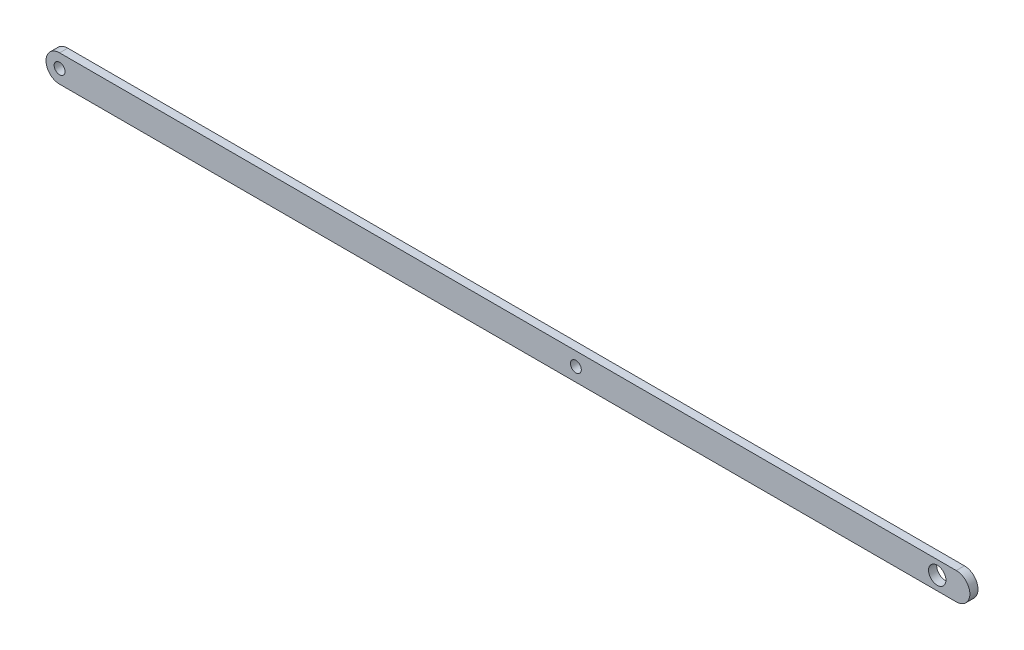
ISO-10303-21;
HEADER;
FILE_DESCRIPTION(('STEP AP214'),'2;1');
FILE_NAME('part.step','',(''),(''),'','','');
FILE_SCHEMA(('AUTOMOTIVE_DESIGN { 1 0 10303 214 1 1 1 1 }'));
ENDSEC;
DATA;
#1=APPLICATION_CONTEXT('core data for automotive mechanical design processes');
#2=APPLICATION_PROTOCOL_DEFINITION('international standard','automotive_design',2000,#1);
#3=PRODUCT_CONTEXT('',#1,'mechanical');
#4=PRODUCT('Part','Part','',(#3));
#5=PRODUCT_RELATED_PRODUCT_CATEGORY('part','',(#4));
#6=PRODUCT_DEFINITION_FORMATION('','',#4);
#7=PRODUCT_DEFINITION_CONTEXT('part definition',#1,'design');
#8=PRODUCT_DEFINITION('design','',#6,#7);
#9=PRODUCT_DEFINITION_SHAPE('','',#8);
#10=(LENGTH_UNIT() NAMED_UNIT(*) SI_UNIT(.MILLI.,.METRE.));
#11=(NAMED_UNIT(*) PLANE_ANGLE_UNIT() SI_UNIT($,.RADIAN.));
#12=(NAMED_UNIT(*) SI_UNIT($,.STERADIAN.) SOLID_ANGLE_UNIT());
#13=UNCERTAINTY_MEASURE_WITH_UNIT(LENGTH_MEASURE(1.E-05),#10,'distance_accuracy_value','');
#14=(GEOMETRIC_REPRESENTATION_CONTEXT(3) GLOBAL_UNCERTAINTY_ASSIGNED_CONTEXT((#13)) GLOBAL_UNIT_ASSIGNED_CONTEXT((#10,
#11,#12)) REPRESENTATION_CONTEXT('',''));
#15=CARTESIAN_POINT('',(0.,0.,0.));
#16=DIRECTION('',(0.,0.,1.));
#17=DIRECTION('',(1.,0.,0.));
#18=AXIS2_PLACEMENT_3D('',#15,#16,#17);
#19=CARTESIAN_POINT('',(0.,0.,3.));
#20=DIRECTION('',(0.,0.,-1.));
#21=DIRECTION('',(-1.,0.,0.));
#22=AXIS2_PLACEMENT_3D('',#19,#20,#21);
#23=CYLINDRICAL_SURFACE('',#22,5.);
#24=CARTESIAN_POINT('',(0.,0.,0.));
#25=DIRECTION('',(0.,0.,1.));
#26=DIRECTION('',(1.,0.,0.));
#27=AXIS2_PLACEMENT_3D('',#24,#25,#26);
#28=CIRCLE('',#27,5.);
#29=CARTESIAN_POINT('',(0.,5.,0.));
#30=VERTEX_POINT('',#29);
#31=CARTESIAN_POINT('',(0.,-5.,0.));
#32=VERTEX_POINT('',#31);
#33=EDGE_CURVE('E110',#30,#32,#28,.T.);
#34=ORIENTED_EDGE('',*,*,#33,.T.);
#35=DIRECTION('',(0.,0.,-1.));
#36=VECTOR('',#35,1.);
#37=CARTESIAN_POINT('',(0.,-5.,3.));
#38=LINE('',#37,#36);
#39=CARTESIAN_POINT('',(0.,-5.,3.));
#40=VERTEX_POINT('',#39);
#41=EDGE_CURVE('E13',#40,#32,#38,.T.);
#42=ORIENTED_EDGE('',*,*,#41,.F.);
#43=CARTESIAN_POINT('',(0.,0.,3.));
#44=DIRECTION('',(0.,0.,1.));
#45=DIRECTION('',(1.,0.,0.));
#46=AXIS2_PLACEMENT_3D('',#43,#44,#45);
#47=CIRCLE('',#46,5.);
#48=CARTESIAN_POINT('',(0.,5.,3.));
#49=VERTEX_POINT('',#48);
#50=EDGE_CURVE('E98',#49,#40,#47,.T.);
#51=ORIENTED_EDGE('',*,*,#50,.F.);
#52=DIRECTION('',(0.,0.,-1.));
#53=VECTOR('',#52,1.);
#54=CARTESIAN_POINT('',(0.,5.,3.));
#55=LINE('',#54,#53);
#56=EDGE_CURVE('E106',#49,#30,#55,.T.);
#57=ORIENTED_EDGE('',*,*,#56,.T.);
#58=EDGE_LOOP('',(#34,#42,#51,#57));
#59=FACE_BOUND('',#58,.T.);
#60=ADVANCED_FACE('F47',(#59),#23,.T.);
#61=CARTESIAN_POINT('',(0.,-5.,3.));
#62=DIRECTION('',(0.,1.,0.));
#63=DIRECTION('',(0.,0.,1.));
#64=AXIS2_PLACEMENT_3D('',#61,#62,#63);
#65=PLANE('',#64);
#66=DIRECTION('',(1.,0.,0.));
#67=VECTOR('',#66,1.);
#68=CARTESIAN_POINT('',(0.,-5.,0.));
#69=LINE('',#68,#67);
#70=CARTESIAN_POINT('',(330.,-5.,0.));
#71=VERTEX_POINT('',#70);
#72=EDGE_CURVE('E102',#32,#71,#69,.T.);
#73=ORIENTED_EDGE('',*,*,#72,.T.);
#74=DIRECTION('',(0.,0.,-1.));
#75=VECTOR('',#74,1.);
#76=CARTESIAN_POINT('',(330.,-5.,3.));
#77=LINE('',#76,#75);
#78=CARTESIAN_POINT('',(330.,-5.,3.));
#79=VERTEX_POINT('',#78);
#80=EDGE_CURVE('E55',#79,#71,#77,.T.);
#81=ORIENTED_EDGE('',*,*,#80,.F.);
#82=DIRECTION('',(1.,0.,0.));
#83=VECTOR('',#82,1.);
#84=CARTESIAN_POINT('',(0.,-5.,3.));
#85=LINE('',#84,#83);
#86=EDGE_CURVE('E93',#40,#79,#85,.T.);
#87=ORIENTED_EDGE('',*,*,#86,.F.);
#88=ORIENTED_EDGE('',*,*,#41,.T.);
#89=EDGE_LOOP('',(#73,#81,#87,#88));
#90=FACE_BOUND('',#89,.T.);
#91=ADVANCED_FACE('F101',(#90),#65,.F.);
#92=CARTESIAN_POINT('',(330.,0.,3.));
#93=DIRECTION('',(0.,0.,-1.));
#94=DIRECTION('',(-1.,0.,0.));
#95=AXIS2_PLACEMENT_3D('',#92,#93,#94);
#96=CYLINDRICAL_SURFACE('',#95,5.);
#97=CARTESIAN_POINT('',(330.,0.,0.));
#98=DIRECTION('',(0.,0.,1.));
#99=DIRECTION('',(1.,0.,0.));
#100=AXIS2_PLACEMENT_3D('',#97,#98,#99);
#101=CIRCLE('',#100,5.);
#102=CARTESIAN_POINT('',(330.,5.,0.));
#103=VERTEX_POINT('',#102);
#104=EDGE_CURVE('E80',#71,#103,#101,.T.);
#105=ORIENTED_EDGE('',*,*,#104,.T.);
#106=DIRECTION('',(0.,0.,-1.));
#107=VECTOR('',#106,1.);
#108=CARTESIAN_POINT('',(330.,5.,3.));
#109=LINE('',#108,#107);
#110=CARTESIAN_POINT('',(330.,5.,3.));
#111=VERTEX_POINT('',#110);
#112=EDGE_CURVE('E103',#111,#103,#109,.T.);
#113=ORIENTED_EDGE('',*,*,#112,.F.);
#114=CARTESIAN_POINT('',(330.,0.,3.));
#115=DIRECTION('',(0.,0.,1.));
#116=DIRECTION('',(1.,0.,0.));
#117=AXIS2_PLACEMENT_3D('',#114,#115,#116);
#118=CIRCLE('',#117,5.);
#119=EDGE_CURVE('E96',#79,#111,#118,.T.);
#120=ORIENTED_EDGE('',*,*,#119,.F.);
#121=ORIENTED_EDGE('',*,*,#80,.T.);
#122=EDGE_LOOP('',(#105,#113,#120,#121));
#123=FACE_BOUND('',#122,.T.);
#124=ADVANCED_FACE('F104',(#123),#96,.T.);
#125=CARTESIAN_POINT('',(0.,5.,3.));
#126=DIRECTION('',(0.,-1.,0.));
#127=DIRECTION('',(0.,0.,-1.));
#128=AXIS2_PLACEMENT_3D('',#125,#126,#127);
#129=PLANE('',#128);
#130=DIRECTION('',(-1.,0.,0.));
#131=VECTOR('',#130,1.);
#132=CARTESIAN_POINT('',(0.,5.,0.));
#133=LINE('',#132,#131);
#134=EDGE_CURVE('E86',#103,#30,#133,.T.);
#135=ORIENTED_EDGE('',*,*,#134,.T.);
#136=ORIENTED_EDGE('',*,*,#56,.F.);
#137=DIRECTION('',(-1.,0.,0.));
#138=VECTOR('',#137,1.);
#139=CARTESIAN_POINT('',(0.,5.,3.));
#140=LINE('',#139,#138);
#141=EDGE_CURVE('E63',#111,#49,#140,.T.);
#142=ORIENTED_EDGE('',*,*,#141,.F.);
#143=ORIENTED_EDGE('',*,*,#112,.T.);
#144=EDGE_LOOP('',(#135,#136,#142,#143));
#145=FACE_BOUND('',#144,.T.);
#146=ADVANCED_FACE('F118',(#145),#129,.F.);
#147=CARTESIAN_POINT('',(0.,0.,3.));
#148=DIRECTION('',(0.,0.,1.));
#149=DIRECTION('',(1.,0.,0.));
#150=AXIS2_PLACEMENT_3D('',#147,#148,#149);
#151=PLANE('',#150);
#152=CARTESIAN_POINT('',(0.,0.,3.));
#153=DIRECTION('',(0.,0.,1.));
#154=DIRECTION('',(1.,0.,0.));
#155=AXIS2_PLACEMENT_3D('',#152,#153,#154);
#156=CIRCLE('',#155,2.);
#157=CARTESIAN_POINT('',(2.,0.,3.));
#158=VERTEX_POINT('',#157);
#159=EDGE_CURVE('E138',#158,#158,#156,.T.);
#160=ORIENTED_EDGE('',*,*,#159,.F.);
#161=EDGE_LOOP('',(#160));
#162=FACE_BOUND('',#161,.T.);
#163=CARTESIAN_POINT('',(190.,0.,3.));
#164=DIRECTION('',(0.,0.,1.));
#165=DIRECTION('',(1.,0.,0.));
#166=AXIS2_PLACEMENT_3D('',#163,#164,#165);
#167=CIRCLE('',#166,2.);
#168=CARTESIAN_POINT('',(192.,0.,3.));
#169=VERTEX_POINT('',#168);
#170=EDGE_CURVE('E132',#169,#169,#167,.T.);
#171=ORIENTED_EDGE('',*,*,#170,.F.);
#172=EDGE_LOOP('',(#171));
#173=FACE_BOUND('',#172,.T.);
#174=CARTESIAN_POINT('',(323.,0.,3.));
#175=DIRECTION('',(0.,0.,1.));
#176=DIRECTION('',(1.,0.,0.));
#177=AXIS2_PLACEMENT_3D('',#174,#175,#176);
#178=CIRCLE('',#177,3.19999999999998);
#179=CARTESIAN_POINT('',(326.2,0.,3.));
#180=VERTEX_POINT('',#179);
#181=EDGE_CURVE('E126',#180,#180,#178,.T.);
#182=ORIENTED_EDGE('',*,*,#181,.F.);
#183=EDGE_LOOP('',(#182));
#184=FACE_BOUND('',#183,.T.);
#185=ORIENTED_EDGE('',*,*,#50,.T.);
#186=ORIENTED_EDGE('',*,*,#86,.T.);
#187=ORIENTED_EDGE('',*,*,#119,.T.);
#188=ORIENTED_EDGE('',*,*,#141,.T.);
#189=EDGE_LOOP('',(#185,#186,#187,#188));
#190=FACE_BOUND('',#189,.T.);
#191=ADVANCED_FACE('F94',(#162,#173,#184,#190),#151,.T.);
#192=CARTESIAN_POINT('',(0.,0.,0.));
#193=DIRECTION('',(0.,0.,1.));
#194=DIRECTION('',(1.,0.,0.));
#195=AXIS2_PLACEMENT_3D('',#192,#193,#194);
#196=PLANE('',#195);
#197=CARTESIAN_POINT('',(0.,0.,0.));
#198=DIRECTION('',(0.,0.,1.));
#199=DIRECTION('',(1.,0.,0.));
#200=AXIS2_PLACEMENT_3D('',#197,#198,#199);
#201=CIRCLE('',#200,2.);
#202=CARTESIAN_POINT('',(2.,0.,0.));
#203=VERTEX_POINT('',#202);
#204=EDGE_CURVE('E135',#203,#203,#201,.F.);
#205=ORIENTED_EDGE('',*,*,#204,.F.);
#206=EDGE_LOOP('',(#205));
#207=FACE_BOUND('',#206,.T.);
#208=CARTESIAN_POINT('',(190.,0.,0.));
#209=DIRECTION('',(0.,0.,1.));
#210=DIRECTION('',(1.,0.,0.));
#211=AXIS2_PLACEMENT_3D('',#208,#209,#210);
#212=CIRCLE('',#211,2.);
#213=CARTESIAN_POINT('',(192.,0.,0.));
#214=VERTEX_POINT('',#213);
#215=EDGE_CURVE('E129',#214,#214,#212,.F.);
#216=ORIENTED_EDGE('',*,*,#215,.F.);
#217=EDGE_LOOP('',(#216));
#218=FACE_BOUND('',#217,.T.);
#219=CARTESIAN_POINT('',(323.,0.,0.));
#220=DIRECTION('',(0.,0.,1.));
#221=DIRECTION('',(1.,0.,0.));
#222=AXIS2_PLACEMENT_3D('',#219,#220,#221);
#223=CIRCLE('',#222,3.19999999999998);
#224=CARTESIAN_POINT('',(326.2,0.,0.));
#225=VERTEX_POINT('',#224);
#226=EDGE_CURVE('E113',#225,#225,#223,.F.);
#227=ORIENTED_EDGE('',*,*,#226,.F.);
#228=EDGE_LOOP('',(#227));
#229=FACE_BOUND('',#228,.T.);
#230=ORIENTED_EDGE('',*,*,#33,.F.);
#231=ORIENTED_EDGE('',*,*,#134,.F.);
#232=ORIENTED_EDGE('',*,*,#104,.F.);
#233=ORIENTED_EDGE('',*,*,#72,.F.);
#234=EDGE_LOOP('',(#230,#231,#232,#233));
#235=FACE_BOUND('',#234,.T.);
#236=ADVANCED_FACE('F121',(#207,#218,#229,#235),#196,.F.);
#237=CARTESIAN_POINT('',(323.,0.,-9.05096679918776));
#238=DIRECTION('',(0.,0.,1.));
#239=DIRECTION('',(1.,0.,0.));
#240=AXIS2_PLACEMENT_3D('',#237,#238,#239);
#241=CYLINDRICAL_SURFACE('',#240,3.19999999999998);
#242=ORIENTED_EDGE('',*,*,#226,.T.);
#243=EDGE_LOOP('',(#242));
#244=FACE_BOUND('',#243,.T.);
#245=ORIENTED_EDGE('',*,*,#181,.T.);
#246=EDGE_LOOP('',(#245));
#247=FACE_BOUND('',#246,.T.);
#248=ADVANCED_FACE('F151',(#244,#247),#241,.F.);
#249=CARTESIAN_POINT('',(190.,0.,-5.65685424949238));
#250=DIRECTION('',(0.,0.,1.));
#251=DIRECTION('',(1.,0.,0.));
#252=AXIS2_PLACEMENT_3D('',#249,#250,#251);
#253=CYLINDRICAL_SURFACE('',#252,2.);
#254=ORIENTED_EDGE('',*,*,#215,.T.);
#255=EDGE_LOOP('',(#254));
#256=FACE_BOUND('',#255,.T.);
#257=ORIENTED_EDGE('',*,*,#170,.T.);
#258=EDGE_LOOP('',(#257));
#259=FACE_BOUND('',#258,.T.);
#260=ADVANCED_FACE('F153',(#256,#259),#253,.F.);
#261=CARTESIAN_POINT('',(0.,0.,-5.65685424949238));
#262=DIRECTION('',(0.,0.,1.));
#263=DIRECTION('',(1.,0.,0.));
#264=AXIS2_PLACEMENT_3D('',#261,#262,#263);
#265=CYLINDRICAL_SURFACE('',#264,2.);
#266=ORIENTED_EDGE('',*,*,#204,.T.);
#267=EDGE_LOOP('',(#266));
#268=FACE_BOUND('',#267,.T.);
#269=ORIENTED_EDGE('',*,*,#159,.T.);
#270=EDGE_LOOP('',(#269));
#271=FACE_BOUND('',#270,.T.);
#272=ADVANCED_FACE('F142',(#268,#271),#265,.F.);
#273=CLOSED_SHELL('',(#60,#91,#124,#146,#191,#236,#248,#260,#272));
#274=MANIFOLD_SOLID_BREP('B2',#273);
#275=ADVANCED_BREP_SHAPE_REPRESENTATION('',(#18,#274),#14);
#276=SHAPE_DEFINITION_REPRESENTATION(#9,#275);
ENDSEC;
END-ISO-10303-21;
